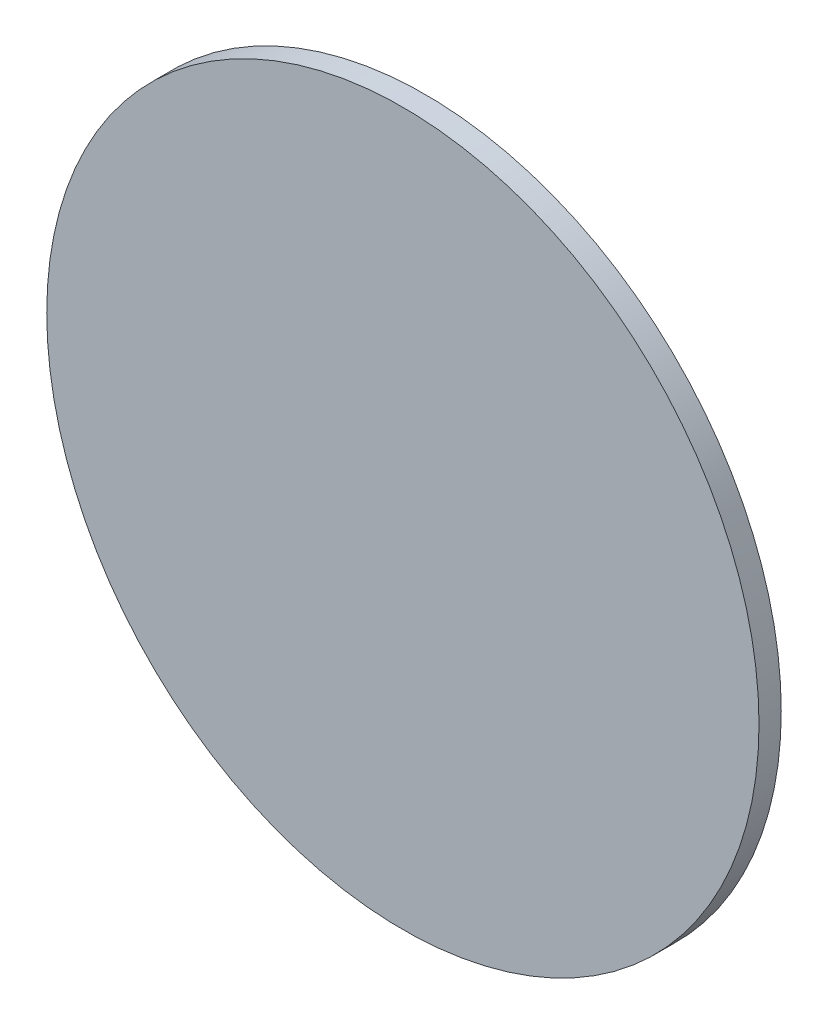
ISO-10303-21;
HEADER;
FILE_DESCRIPTION(('STEP AP214'),'2;1');
FILE_NAME('part.step','',(''),(''),'','','');
FILE_SCHEMA(('AUTOMOTIVE_DESIGN { 1 0 10303 214 1 1 1 1 }'));
ENDSEC;
DATA;
#1=APPLICATION_CONTEXT('core data for automotive mechanical design processes');
#2=APPLICATION_PROTOCOL_DEFINITION('international standard','automotive_design',2000,#1);
#3=PRODUCT_CONTEXT('',#1,'mechanical');
#4=PRODUCT('Part','Part','',(#3));
#5=PRODUCT_RELATED_PRODUCT_CATEGORY('part','',(#4));
#6=PRODUCT_DEFINITION_FORMATION('','',#4);
#7=PRODUCT_DEFINITION_CONTEXT('part definition',#1,'design');
#8=PRODUCT_DEFINITION('design','',#6,#7);
#9=PRODUCT_DEFINITION_SHAPE('','',#8);
#10=(LENGTH_UNIT() NAMED_UNIT(*) SI_UNIT(.MILLI.,.METRE.));
#11=(NAMED_UNIT(*) PLANE_ANGLE_UNIT() SI_UNIT($,.RADIAN.));
#12=(NAMED_UNIT(*) SI_UNIT($,.STERADIAN.) SOLID_ANGLE_UNIT());
#13=UNCERTAINTY_MEASURE_WITH_UNIT(LENGTH_MEASURE(1.E-05),#10,'distance_accuracy_value','');
#14=(GEOMETRIC_REPRESENTATION_CONTEXT(3) GLOBAL_UNCERTAINTY_ASSIGNED_CONTEXT((#13)) GLOBAL_UNIT_ASSIGNED_CONTEXT((#10,
#11,#12)) REPRESENTATION_CONTEXT('',''));
#15=CARTESIAN_POINT('',(0.,0.,0.));
#16=DIRECTION('',(0.,0.,1.));
#17=DIRECTION('',(1.,0.,0.));
#18=AXIS2_PLACEMENT_3D('',#15,#16,#17);
#19=CARTESIAN_POINT('',(0.,0.,3.175));
#20=DIRECTION('',(0.,0.,-1.));
#21=DIRECTION('',(-1.,0.,0.));
#22=AXIS2_PLACEMENT_3D('',#19,#20,#21);
#23=CYLINDRICAL_SURFACE('',#22,50.8);
#24=CARTESIAN_POINT('',(0.,0.,3.175));
#25=DIRECTION('',(0.,0.,1.));
#26=DIRECTION('',(1.,0.,0.));
#27=AXIS2_PLACEMENT_3D('',#24,#25,#26);
#28=CIRCLE('',#27,50.8);
#29=CARTESIAN_POINT('',(50.8,0.,3.175));
#30=VERTEX_POINT('',#29);
#31=EDGE_CURVE('E11',#30,#30,#28,.T.);
#32=ORIENTED_EDGE('',*,*,#31,.F.);
#33=EDGE_LOOP('',(#32));
#34=FACE_BOUND('',#33,.T.);
#35=CARTESIAN_POINT('',(0.,0.,0.));
#36=DIRECTION('',(0.,0.,1.));
#37=DIRECTION('',(1.,0.,0.));
#38=AXIS2_PLACEMENT_3D('',#35,#36,#37);
#39=CIRCLE('',#38,50.8);
#40=CARTESIAN_POINT('',(50.8,0.,0.));
#41=VERTEX_POINT('',#40);
#42=EDGE_CURVE('E41',#41,#41,#39,.T.);
#43=ORIENTED_EDGE('',*,*,#42,.T.);
#44=EDGE_LOOP('',(#43));
#45=FACE_BOUND('',#44,.T.);
#46=ADVANCED_FACE('F38',(#34,#45),#23,.T.);
#47=CARTESIAN_POINT('',(0.,0.,3.175));
#48=DIRECTION('',(0.,0.,1.));
#49=DIRECTION('',(1.,0.,0.));
#50=AXIS2_PLACEMENT_3D('',#47,#48,#49);
#51=PLANE('',#50);
#52=ORIENTED_EDGE('',*,*,#31,.T.);
#53=EDGE_LOOP('',(#52));
#54=FACE_BOUND('',#53,.T.);
#55=ADVANCED_FACE('F54',(#54),#51,.T.);
#56=CARTESIAN_POINT('',(0.,0.,0.));
#57=DIRECTION('',(0.,0.,1.));
#58=DIRECTION('',(1.,0.,0.));
#59=AXIS2_PLACEMENT_3D('',#56,#57,#58);
#60=PLANE('',#59);
#61=ORIENTED_EDGE('',*,*,#42,.F.);
#62=EDGE_LOOP('',(#61));
#63=FACE_BOUND('',#62,.T.);
#64=ADVANCED_FACE('F52',(#63),#60,.F.);
#65=CLOSED_SHELL('',(#46,#55,#64));
#66=MANIFOLD_SOLID_BREP('B2',#65);
#67=ADVANCED_BREP_SHAPE_REPRESENTATION('',(#18,#66),#14);
#68=SHAPE_DEFINITION_REPRESENTATION(#9,#67);
ENDSEC;
END-ISO-10303-21;
